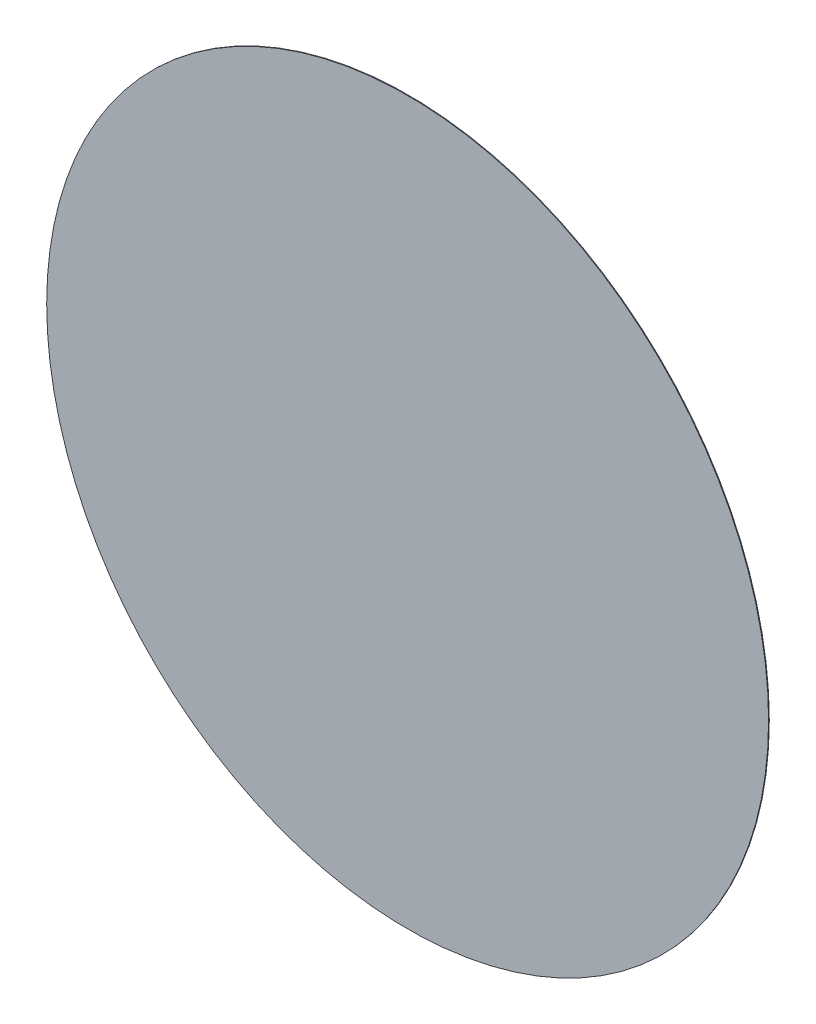
ISO-10303-21;
HEADER;
FILE_DESCRIPTION(('STEP AP214'),'2;1');
FILE_NAME('part.step','',(''),(''),'','','');
FILE_SCHEMA(('AUTOMOTIVE_DESIGN { 1 0 10303 214 1 1 1 1 }'));
ENDSEC;
DATA;
#1=APPLICATION_CONTEXT('core data for automotive mechanical design processes');
#2=APPLICATION_PROTOCOL_DEFINITION('international standard','automotive_design',2000,#1);
#3=PRODUCT_CONTEXT('',#1,'mechanical');
#4=PRODUCT('Part','Part','',(#3));
#5=PRODUCT_RELATED_PRODUCT_CATEGORY('part','',(#4));
#6=PRODUCT_DEFINITION_FORMATION('','',#4);
#7=PRODUCT_DEFINITION_CONTEXT('part definition',#1,'design');
#8=PRODUCT_DEFINITION('design','',#6,#7);
#9=PRODUCT_DEFINITION_SHAPE('','',#8);
#10=(LENGTH_UNIT() NAMED_UNIT(*) SI_UNIT(.MILLI.,.METRE.));
#11=(NAMED_UNIT(*) PLANE_ANGLE_UNIT() SI_UNIT($,.RADIAN.));
#12=(NAMED_UNIT(*) SI_UNIT($,.STERADIAN.) SOLID_ANGLE_UNIT());
#13=UNCERTAINTY_MEASURE_WITH_UNIT(LENGTH_MEASURE(1.E-05),#10,'distance_accuracy_value','');
#14=(GEOMETRIC_REPRESENTATION_CONTEXT(3) GLOBAL_UNCERTAINTY_ASSIGNED_CONTEXT((#13)) GLOBAL_UNIT_ASSIGNED_CONTEXT((#10,
#11,#12)) REPRESENTATION_CONTEXT('',''));
#15=CARTESIAN_POINT('',(0.,0.,0.));
#16=DIRECTION('',(0.,0.,1.));
#17=DIRECTION('',(1.,0.,0.));
#18=AXIS2_PLACEMENT_3D('',#15,#16,#17);
#19=CARTESIAN_POINT('',(13.9699969745874,-1.1297440254809,0.));
#20=DIRECTION('',(0.,0.,1.));
#21=DIRECTION('',(1.,0.,0.));
#22=AXIS2_PLACEMENT_3D('',#19,#20,#21);
#23=CYLINDRICAL_SURFACE('',#22,0.5);
#24=CARTESIAN_POINT('',(13.9699969745874,-1.1297440254809,0.001));
#25=DIRECTION('',(0.,0.,1.));
#26=DIRECTION('',(1.,0.,0.));
#27=AXIS2_PLACEMENT_3D('',#24,#25,#26);
#28=CIRCLE('',#27,0.5);
#29=CARTESIAN_POINT('',(14.4699969745874,-1.1297440254809,0.001));
#30=VERTEX_POINT('',#29);
#31=CARTESIAN_POINT('',(13.4699969745874,-1.1297440254809,0.001));
#32=VERTEX_POINT('',#31);
#33=EDGE_CURVE('E11',#30,#32,#28,.T.);
#34=ORIENTED_EDGE('',*,*,#33,.F.);
#35=CARTESIAN_POINT('',(13.9699969745874,-1.1297440254809,0.001));
#36=DIRECTION('',(0.,0.,1.));
#37=DIRECTION('',(1.,0.,0.));
#38=AXIS2_PLACEMENT_3D('',#35,#36,#37);
#39=CIRCLE('',#38,0.5);
#40=EDGE_CURVE('E24',#32,#30,#39,.T.);
#41=ORIENTED_EDGE('',*,*,#40,.F.);
#42=DIRECTION('',(0.,0.,-1.));
#43=VECTOR('',#42,1.);
#44=CARTESIAN_POINT('',(13.4699969745874,-1.1297440254809,0.));
#45=LINE('',#44,#43);
#46=CARTESIAN_POINT('',(13.4699969745874,-1.1297440254809,0.));
#47=VERTEX_POINT('',#46);
#48=EDGE_CURVE('E43',#32,#47,#45,.T.);
#49=ORIENTED_EDGE('',*,*,#48,.T.);
#50=CARTESIAN_POINT('',(13.9699969745874,-1.1297440254809,0.));
#51=DIRECTION('',(0.,0.,1.));
#52=DIRECTION('',(1.,0.,0.));
#53=AXIS2_PLACEMENT_3D('',#50,#51,#52);
#54=CIRCLE('',#53,0.5);
#55=CARTESIAN_POINT('',(14.4699969745874,-1.1297440254809,0.));
#56=VERTEX_POINT('',#55);
#57=EDGE_CURVE('E40',#47,#56,#54,.T.);
#58=ORIENTED_EDGE('',*,*,#57,.T.);
#59=CARTESIAN_POINT('',(13.9699969745874,-1.1297440254809,0.));
#60=DIRECTION('',(0.,0.,1.));
#61=DIRECTION('',(1.,0.,0.));
#62=AXIS2_PLACEMENT_3D('',#59,#60,#61);
#63=CIRCLE('',#62,0.5);
#64=EDGE_CURVE('E42',#56,#47,#63,.T.);
#65=ORIENTED_EDGE('',*,*,#64,.T.);
#66=ORIENTED_EDGE('',*,*,#48,.F.);
#67=EDGE_LOOP('',(#34,#41,#49,#58,#65,#66));
#68=FACE_BOUND('',#67,.T.);
#69=ADVANCED_FACE('F17',(#68),#23,.T.);
#70=CARTESIAN_POINT('',(13.9699969745874,-1.1297440254809,0.001));
#71=DIRECTION('',(0.,0.,1.));
#72=DIRECTION('',(1.,0.,0.));
#73=AXIS2_PLACEMENT_3D('',#70,#71,#72);
#74=PLANE('',#73);
#75=ORIENTED_EDGE('',*,*,#33,.T.);
#76=ORIENTED_EDGE('',*,*,#40,.T.);
#77=EDGE_LOOP('',(#75,#76));
#78=FACE_BOUND('',#77,.T.);
#79=ADVANCED_FACE('F49',(#78),#74,.T.);
#80=CARTESIAN_POINT('',(13.9699969745874,-1.1297440254809,0.));
#81=DIRECTION('',(0.,0.,1.));
#82=DIRECTION('',(1.,0.,0.));
#83=AXIS2_PLACEMENT_3D('',#80,#81,#82);
#84=PLANE('',#83);
#85=ORIENTED_EDGE('',*,*,#64,.F.);
#86=ORIENTED_EDGE('',*,*,#57,.F.);
#87=EDGE_LOOP('',(#85,#86));
#88=FACE_BOUND('',#87,.T.);
#89=ADVANCED_FACE('F46',(#88),#84,.F.);
#90=CLOSED_SHELL('',(#69,#79,#89));
#91=MANIFOLD_SOLID_BREP('B1',#90);
#92=ADVANCED_BREP_SHAPE_REPRESENTATION('',(#18,#91),#14);
#93=SHAPE_DEFINITION_REPRESENTATION(#9,#92);
ENDSEC;
END-ISO-10303-21;
